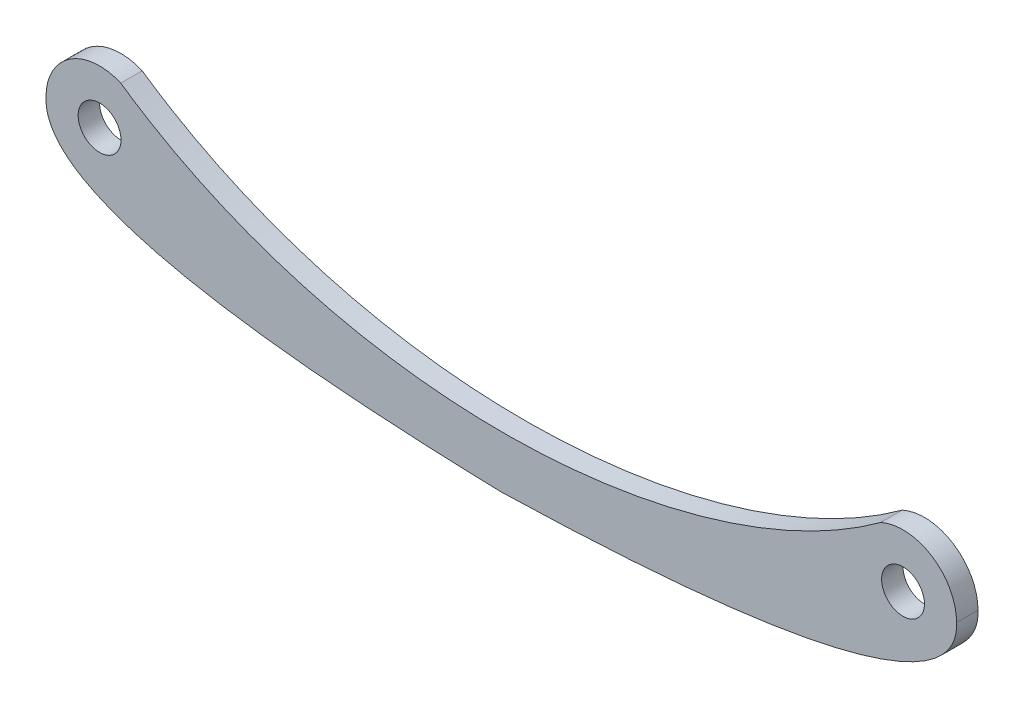
ISO-10303-21;
HEADER;
FILE_DESCRIPTION(('STEP AP214'),'2;1');
FILE_NAME('part.step','',(''),(''),'','','');
FILE_SCHEMA(('AUTOMOTIVE_DESIGN { 1 0 10303 214 1 1 1 1 }'));
ENDSEC;
DATA;
#1=APPLICATION_CONTEXT('core data for automotive mechanical design processes');
#2=APPLICATION_PROTOCOL_DEFINITION('international standard','automotive_design',2000,#1);
#3=PRODUCT_CONTEXT('',#1,'mechanical');
#4=PRODUCT('Part','Part','',(#3));
#5=PRODUCT_RELATED_PRODUCT_CATEGORY('part','',(#4));
#6=PRODUCT_DEFINITION_FORMATION('','',#4);
#7=PRODUCT_DEFINITION_CONTEXT('part definition',#1,'design');
#8=PRODUCT_DEFINITION('design','',#6,#7);
#9=PRODUCT_DEFINITION_SHAPE('','',#8);
#10=(LENGTH_UNIT() NAMED_UNIT(*) SI_UNIT(.MILLI.,.METRE.));
#11=(NAMED_UNIT(*) PLANE_ANGLE_UNIT() SI_UNIT($,.RADIAN.));
#12=(NAMED_UNIT(*) SI_UNIT($,.STERADIAN.) SOLID_ANGLE_UNIT());
#13=UNCERTAINTY_MEASURE_WITH_UNIT(LENGTH_MEASURE(1.E-05),#10,'distance_accuracy_value','');
#14=(GEOMETRIC_REPRESENTATION_CONTEXT(3) GLOBAL_UNCERTAINTY_ASSIGNED_CONTEXT((#13)) GLOBAL_UNIT_ASSIGNED_CONTEXT((#10,
#11,#12)) REPRESENTATION_CONTEXT('',''));
#15=CARTESIAN_POINT('',(0.,0.,0.));
#16=DIRECTION('',(0.,0.,1.));
#17=DIRECTION('',(1.,0.,0.));
#18=AXIS2_PLACEMENT_3D('',#15,#16,#17);
#19=CARTESIAN_POINT('',(10.8048928814692,-14.9181599133934,4.));
#20=DIRECTION('',(0.,0.,-1.));
#21=DIRECTION('',(-1.,0.,0.));
#22=AXIS2_PLACEMENT_3D('',#19,#20,#21);
#23=PLANE('',#22);
#24=CARTESIAN_POINT('',(-9.99999999999674,0.,4.));
#25=CARTESIAN_POINT('',(-10.8902142370632,-19.1353413607899,4.));
#26=CARTESIAN_POINT('',(75.0000000000002,-21.4019569319938,4.));
#27=B_SPLINE_CURVE_WITH_KNOTS('',2,(#24,#25,#26),.UNSPECIFIED.,.F.,.F.,(3,3),(0.,1.),.UNSPECIFIED.);
#28=CARTESIAN_POINT('',(-9.99999999999674,0.,4.));
#29=VERTEX_POINT('',#28);
#30=CARTESIAN_POINT('',(74.9999999999998,-21.4019569319938,4.));
#31=VERTEX_POINT('',#30);
#32=EDGE_CURVE('E128',#29,#31,#27,.T.);
#33=ORIENTED_EDGE('',*,*,#32,.T.);
#34=CARTESIAN_POINT('',(74.9999999999998,-21.4019569319938,4.));
#35=CARTESIAN_POINT('',(160.890214237063,-19.1353413607899,4.));
#36=CARTESIAN_POINT('',(159.999999999997,0.,4.));
#37=B_SPLINE_CURVE_WITH_KNOTS('',2,(#34,#35,#36),.UNSPECIFIED.,.F.,.F.,(3,3),(0.,1.),.UNSPECIFIED.);
#38=CARTESIAN_POINT('',(159.999999999997,0.,4.));
#39=VERTEX_POINT('',#38);
#40=EDGE_CURVE('E86',#31,#39,#37,.T.);
#41=ORIENTED_EDGE('',*,*,#40,.T.);
#42=CARTESIAN_POINT('',(150.,0.,4.));
#43=DIRECTION('',(0.,0.,1.));
#44=DIRECTION('',(1.,0.,0.));
#45=AXIS2_PLACEMENT_3D('',#42,#43,#44);
#46=CIRCLE('',#45,9.99999999999674);
#47=CARTESIAN_POINT('',(145.865990445887,9.10549092616315,4.));
#48=VERTEX_POINT('',#47);
#49=EDGE_CURVE('E90',#39,#48,#46,.T.);
#50=ORIENTED_EDGE('',*,*,#49,.T.);
#51=CARTESIAN_POINT('',(145.865990445887,9.10549092616315,4.));
#52=CARTESIAN_POINT('',(110.551742639104,-16.7070402195439,4.));
#53=CARTESIAN_POINT('',(46.9064884555261,-20.3737462545654,4.));
#54=CARTESIAN_POINT('',(3.94804782574258,9.18765031798577,4.));
#55=B_SPLINE_CURVE_WITH_KNOTS('',3,(#51,#52,#53,#54),.UNSPECIFIED.,.F.,.F.,(4,4),
(0.0224489478043279,0.850781245648387),.UNSPECIFIED.);
#56=CARTESIAN_POINT('',(3.94804782574258,9.18765031798577,4.));
#57=VERTEX_POINT('',#56);
#58=EDGE_CURVE('E94',#48,#57,#55,.T.);
#59=ORIENTED_EDGE('',*,*,#58,.T.);
#60=CARTESIAN_POINT('',(0.,0.,4.));
#61=DIRECTION('',(0.,0.,1.));
#62=DIRECTION('',(1.,0.,0.));
#63=AXIS2_PLACEMENT_3D('',#60,#61,#62);
#64=CIRCLE('',#63,9.99999999999674);
#65=EDGE_CURVE('E52',#57,#29,#64,.T.);
#66=ORIENTED_EDGE('',*,*,#65,.T.);
#67=EDGE_LOOP('',(#33,#41,#50,#59,#66));
#68=FACE_BOUND('',#67,.T.);
#69=CARTESIAN_POINT('',(0.,0.,4.));
#70=DIRECTION('',(0.,0.,1.));
#71=DIRECTION('',(1.,0.,0.));
#72=AXIS2_PLACEMENT_3D('',#69,#70,#71);
#73=CIRCLE('',#72,4.);
#74=CARTESIAN_POINT('',(4.,0.,4.));
#75=VERTEX_POINT('',#74);
#76=EDGE_CURVE('E142',#75,#75,#73,.T.);
#77=ORIENTED_EDGE('',*,*,#76,.F.);
#78=EDGE_LOOP('',(#77));
#79=FACE_BOUND('',#78,.T.);
#80=CARTESIAN_POINT('',(150.,0.,4.));
#81=DIRECTION('',(0.,0.,1.));
#82=DIRECTION('',(1.,0.,0.));
#83=AXIS2_PLACEMENT_3D('',#80,#81,#82);
#84=CIRCLE('',#83,3.99999999999999);
#85=CARTESIAN_POINT('',(154.,0.,4.));
#86=VERTEX_POINT('',#85);
#87=EDGE_CURVE('E143',#86,#86,#84,.T.);
#88=ORIENTED_EDGE('',*,*,#87,.F.);
#89=EDGE_LOOP('',(#88));
#90=FACE_BOUND('',#89,.T.);
#91=ADVANCED_FACE('F34',(#68,#79,#90),#23,.F.);
#92=CARTESIAN_POINT('',(10.8048928814692,-14.9181599133934,0.));
#93=DIRECTION('',(0.,0.,-1.));
#94=DIRECTION('',(-1.,0.,0.));
#95=AXIS2_PLACEMENT_3D('',#92,#93,#94);
#96=PLANE('',#95);
#97=CARTESIAN_POINT('',(0.,0.,0.));
#98=DIRECTION('',(0.,0.,1.));
#99=DIRECTION('',(1.,0.,0.));
#100=AXIS2_PLACEMENT_3D('',#97,#98,#99);
#101=CIRCLE('',#100,4.);
#102=CARTESIAN_POINT('',(4.,0.,0.));
#103=VERTEX_POINT('',#102);
#104=EDGE_CURVE('E136',#103,#103,#101,.T.);
#105=ORIENTED_EDGE('',*,*,#104,.T.);
#106=EDGE_LOOP('',(#105));
#107=FACE_BOUND('',#106,.T.);
#108=CARTESIAN_POINT('',(-9.99999999999674,0.,0.));
#109=CARTESIAN_POINT('',(-10.8902142370632,-19.1353413607899,0.));
#110=CARTESIAN_POINT('',(75.0000000000002,-21.4019569319938,0.));
#111=B_SPLINE_CURVE_WITH_KNOTS('',2,(#108,#109,#110),.UNSPECIFIED.,.F.,.F.,(3,3),(0.,1.),.UNSPECIFIED.);
#112=CARTESIAN_POINT('',(-9.99999999999674,0.,0.));
#113=VERTEX_POINT('',#112);
#114=CARTESIAN_POINT('',(74.9999999999998,-21.4019569319938,0.));
#115=VERTEX_POINT('',#114);
#116=EDGE_CURVE('E146',#113,#115,#111,.T.);
#117=ORIENTED_EDGE('',*,*,#116,.F.);
#118=CARTESIAN_POINT('',(0.,0.,0.));
#119=DIRECTION('',(0.,0.,1.));
#120=DIRECTION('',(1.,0.,0.));
#121=AXIS2_PLACEMENT_3D('',#118,#119,#120);
#122=CIRCLE('',#121,9.99999999999674);
#123=CARTESIAN_POINT('',(3.94804782574258,9.18765031798577,0.));
#124=VERTEX_POINT('',#123);
#125=EDGE_CURVE('E78',#124,#113,#122,.T.);
#126=ORIENTED_EDGE('',*,*,#125,.F.);
#127=CARTESIAN_POINT('',(145.865990445887,9.10549092616315,0.));
#128=CARTESIAN_POINT('',(110.551742639104,-16.7070402195439,0.));
#129=CARTESIAN_POINT('',(46.9064884555261,-20.3737462545654,0.));
#130=CARTESIAN_POINT('',(3.94804782574258,9.18765031798577,0.));
#131=B_SPLINE_CURVE_WITH_KNOTS('',3,(#127,#128,#129,#130),.UNSPECIFIED.,.F.,.F.,(4,4),
(0.0224489478043279,0.850781245648387),.UNSPECIFIED.);
#132=CARTESIAN_POINT('',(145.865990445887,9.10549092616315,0.));
#133=VERTEX_POINT('',#132);
#134=EDGE_CURVE('E72',#133,#124,#131,.T.);
#135=ORIENTED_EDGE('',*,*,#134,.F.);
#136=CARTESIAN_POINT('',(150.,0.,0.));
#137=DIRECTION('',(0.,0.,1.));
#138=DIRECTION('',(1.,0.,0.));
#139=AXIS2_PLACEMENT_3D('',#136,#137,#138);
#140=CIRCLE('',#139,9.99999999999674);
#141=CARTESIAN_POINT('',(159.999999999997,0.,0.));
#142=VERTEX_POINT('',#141);
#143=EDGE_CURVE('E101',#142,#133,#140,.T.);
#144=ORIENTED_EDGE('',*,*,#143,.F.);
#145=CARTESIAN_POINT('',(74.9999999999998,-21.4019569319938,0.));
#146=CARTESIAN_POINT('',(160.890214237063,-19.1353413607899,0.));
#147=CARTESIAN_POINT('',(159.999999999997,0.,0.));
#148=B_SPLINE_CURVE_WITH_KNOTS('',2,(#145,#146,#147),.UNSPECIFIED.,.F.,.F.,(3,3),(0.,1.),.UNSPECIFIED.);
#149=EDGE_CURVE('E229',#115,#142,#148,.T.);
#150=ORIENTED_EDGE('',*,*,#149,.F.);
#151=EDGE_LOOP('',(#117,#126,#135,#144,#150));
#152=FACE_BOUND('',#151,.T.);
#153=CARTESIAN_POINT('',(150.,0.,0.));
#154=DIRECTION('',(0.,0.,1.));
#155=DIRECTION('',(1.,0.,0.));
#156=AXIS2_PLACEMENT_3D('',#153,#154,#155);
#157=CIRCLE('',#156,3.99999999999999);
#158=CARTESIAN_POINT('',(154.,0.,0.));
#159=VERTEX_POINT('',#158);
#160=EDGE_CURVE('E147',#159,#159,#157,.T.);
#161=ORIENTED_EDGE('',*,*,#160,.T.);
#162=EDGE_LOOP('',(#161));
#163=FACE_BOUND('',#162,.T.);
#164=ADVANCED_FACE('F157',(#107,#152,#163),#96,.T.);
#165=DIRECTION('',(0.,0.,-1.));
#166=VECTOR('',#165,1.);
#167=SURFACE_OF_LINEAR_EXTRUSION('',#27,#166);
#168=ORIENTED_EDGE('',*,*,#116,.T.);
#169=DIRECTION('',(0.,0.,-1.));
#170=VECTOR('',#169,1.);
#171=CARTESIAN_POINT('',(74.9999999999998,-21.4019569319938,4.));
#172=LINE('',#171,#170);
#173=EDGE_CURVE('E11',#31,#115,#172,.T.);
#174=ORIENTED_EDGE('',*,*,#173,.F.);
#175=ORIENTED_EDGE('',*,*,#32,.F.);
#176=DIRECTION('',(0.,0.,-1.));
#177=VECTOR('',#176,1.);
#178=CARTESIAN_POINT('',(-9.99999999999674,0.,4.));
#179=LINE('',#178,#177);
#180=EDGE_CURVE('E106',#29,#113,#179,.T.);
#181=ORIENTED_EDGE('',*,*,#180,.T.);
#182=EDGE_LOOP('',(#168,#174,#175,#181));
#183=FACE_BOUND('',#182,.T.);
#184=ADVANCED_FACE('F36',(#183),#167,.F.);
#185=DIRECTION('',(0.,0.,-1.));
#186=VECTOR('',#185,1.);
#187=SURFACE_OF_LINEAR_EXTRUSION('',#37,#186);
#188=ORIENTED_EDGE('',*,*,#149,.T.);
#189=DIRECTION('',(0.,0.,-1.));
#190=VECTOR('',#189,1.);
#191=CARTESIAN_POINT('',(159.999999999997,0.,4.));
#192=LINE('',#191,#190);
#193=EDGE_CURVE('E44',#39,#142,#192,.T.);
#194=ORIENTED_EDGE('',*,*,#193,.F.);
#195=ORIENTED_EDGE('',*,*,#40,.F.);
#196=ORIENTED_EDGE('',*,*,#173,.T.);
#197=EDGE_LOOP('',(#188,#194,#195,#196));
#198=FACE_BOUND('',#197,.T.);
#199=ADVANCED_FACE('F123',(#198),#187,.F.);
#200=CARTESIAN_POINT('',(150.,0.,4.));
#201=DIRECTION('',(0.,0.,-1.));
#202=DIRECTION('',(-1.,0.,0.));
#203=AXIS2_PLACEMENT_3D('',#200,#201,#202);
#204=CYLINDRICAL_SURFACE('',#203,9.99999999999674);
#205=ORIENTED_EDGE('',*,*,#143,.T.);
#206=DIRECTION('',(0.,0.,-1.));
#207=VECTOR('',#206,1.);
#208=CARTESIAN_POINT('',(145.865990445887,9.10549092616315,4.));
#209=LINE('',#208,#207);
#210=EDGE_CURVE('E98',#48,#133,#209,.T.);
#211=ORIENTED_EDGE('',*,*,#210,.F.);
#212=ORIENTED_EDGE('',*,*,#49,.F.);
#213=ORIENTED_EDGE('',*,*,#193,.T.);
#214=EDGE_LOOP('',(#205,#211,#212,#213));
#215=FACE_BOUND('',#214,.T.);
#216=ADVANCED_FACE('F99',(#215),#204,.T.);
#217=DIRECTION('',(0.,0.,-1.));
#218=VECTOR('',#217,1.);
#219=SURFACE_OF_LINEAR_EXTRUSION('',#55,#218);
#220=ORIENTED_EDGE('',*,*,#134,.T.);
#221=DIRECTION('',(0.,0.,-1.));
#222=VECTOR('',#221,1.);
#223=CARTESIAN_POINT('',(3.94804782574258,9.18765031798577,4.));
#224=LINE('',#223,#222);
#225=EDGE_CURVE('E102',#57,#124,#224,.T.);
#226=ORIENTED_EDGE('',*,*,#225,.F.);
#227=ORIENTED_EDGE('',*,*,#58,.F.);
#228=ORIENTED_EDGE('',*,*,#210,.T.);
#229=EDGE_LOOP('',(#220,#226,#227,#228));
#230=FACE_BOUND('',#229,.T.);
#231=ADVANCED_FACE('F104',(#230),#219,.F.);
#232=CARTESIAN_POINT('',(0.,0.,4.));
#233=DIRECTION('',(0.,0.,-1.));
#234=DIRECTION('',(-1.,0.,0.));
#235=AXIS2_PLACEMENT_3D('',#232,#233,#234);
#236=CYLINDRICAL_SURFACE('',#235,9.99999999999674);
#237=ORIENTED_EDGE('',*,*,#125,.T.);
#238=ORIENTED_EDGE('',*,*,#180,.F.);
#239=ORIENTED_EDGE('',*,*,#65,.F.);
#240=ORIENTED_EDGE('',*,*,#225,.T.);
#241=EDGE_LOOP('',(#237,#238,#239,#240));
#242=FACE_BOUND('',#241,.T.);
#243=ADVANCED_FACE('F120',(#242),#236,.T.);
#244=CARTESIAN_POINT('',(0.,0.,4.));
#245=DIRECTION('',(0.,0.,-1.));
#246=DIRECTION('',(-1.,0.,0.));
#247=AXIS2_PLACEMENT_3D('',#244,#245,#246);
#248=CYLINDRICAL_SURFACE('',#247,4.);
#249=ORIENTED_EDGE('',*,*,#76,.T.);
#250=EDGE_LOOP('',(#249));
#251=FACE_BOUND('',#250,.T.);
#252=ORIENTED_EDGE('',*,*,#104,.F.);
#253=EDGE_LOOP('',(#252));
#254=FACE_BOUND('',#253,.T.);
#255=ADVANCED_FACE('F164',(#251,#254),#248,.F.);
#256=CARTESIAN_POINT('',(150.,0.,4.));
#257=DIRECTION('',(0.,0.,-1.));
#258=DIRECTION('',(-1.,0.,0.));
#259=AXIS2_PLACEMENT_3D('',#256,#257,#258);
#260=CYLINDRICAL_SURFACE('',#259,3.99999999999999);
#261=ORIENTED_EDGE('',*,*,#87,.T.);
#262=EDGE_LOOP('',(#261));
#263=FACE_BOUND('',#262,.T.);
#264=ORIENTED_EDGE('',*,*,#160,.F.);
#265=EDGE_LOOP('',(#264));
#266=FACE_BOUND('',#265,.T.);
#267=ADVANCED_FACE('F153',(#263,#266),#260,.F.);
#268=CLOSED_SHELL('',(#91,#164,#184,#199,#216,#231,#243,#255,#267));
#269=MANIFOLD_SOLID_BREP('B2',#268);
#270=ADVANCED_BREP_SHAPE_REPRESENTATION('',(#18,#269),#14);
#271=SHAPE_DEFINITION_REPRESENTATION(#9,#270);
ENDSEC;
END-ISO-10303-21;
